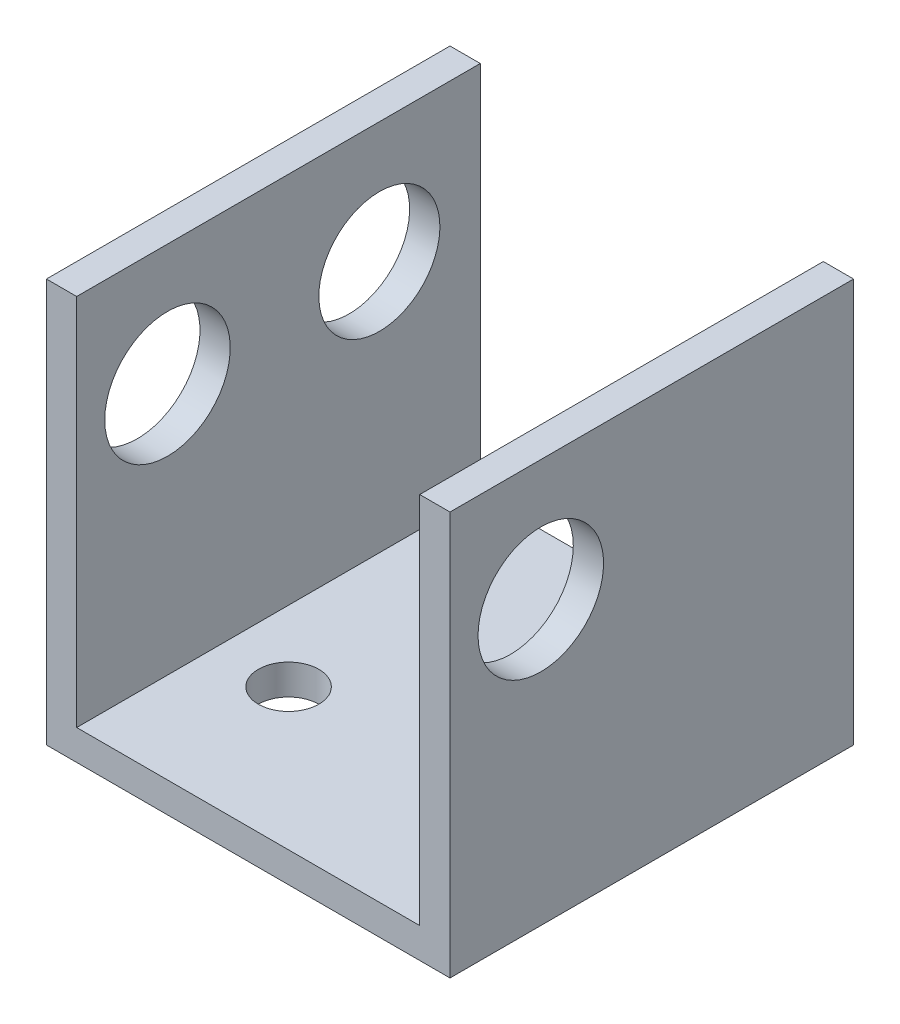
ISO-10303-21;
HEADER;
FILE_DESCRIPTION(('STEP AP214'),'2;1');
FILE_NAME('part.step','',(''),(''),'','','');
FILE_SCHEMA(('AUTOMOTIVE_DESIGN { 1 0 10303 214 1 1 1 1 }'));
ENDSEC;
DATA;
#1=APPLICATION_CONTEXT('core data for automotive mechanical design processes');
#2=APPLICATION_PROTOCOL_DEFINITION('international standard','automotive_design',2000,#1);
#3=PRODUCT_CONTEXT('',#1,'mechanical');
#4=PRODUCT('Part','Part','',(#3));
#5=PRODUCT_RELATED_PRODUCT_CATEGORY('part','',(#4));
#6=PRODUCT_DEFINITION_FORMATION('','',#4);
#7=PRODUCT_DEFINITION_CONTEXT('part definition',#1,'design');
#8=PRODUCT_DEFINITION('design','',#6,#7);
#9=PRODUCT_DEFINITION_SHAPE('','',#8);
#10=(LENGTH_UNIT() NAMED_UNIT(*) SI_UNIT(.MILLI.,.METRE.));
#11=(NAMED_UNIT(*) PLANE_ANGLE_UNIT() SI_UNIT($,.RADIAN.));
#12=(NAMED_UNIT(*) SI_UNIT($,.STERADIAN.) SOLID_ANGLE_UNIT());
#13=UNCERTAINTY_MEASURE_WITH_UNIT(LENGTH_MEASURE(1.E-05),#10,'distance_accuracy_value','');
#14=(GEOMETRIC_REPRESENTATION_CONTEXT(3) GLOBAL_UNCERTAINTY_ASSIGNED_CONTEXT((#13)) GLOBAL_UNIT_ASSIGNED_CONTEXT((#10,
#11,#12)) REPRESENTATION_CONTEXT('',''));
#15=CARTESIAN_POINT('',(0.,0.,0.));
#16=DIRECTION('',(0.,0.,1.));
#17=DIRECTION('',(1.,0.,0.));
#18=AXIS2_PLACEMENT_3D('',#15,#16,#17);
#19=CARTESIAN_POINT('',(-31.1485585296292,-16.6161569826708,20.));
#20=DIRECTION('',(1.,0.,0.));
#21=DIRECTION('',(0.,0.,-1.));
#22=AXIS2_PLACEMENT_3D('',#19,#20,#21);
#23=PLANE('',#22);
#24=CARTESIAN_POINT('',(-31.1485585296292,-2.61615698267076,15.5));
#25=DIRECTION('',(-1.,0.,0.));
#26=DIRECTION('',(0.,0.,1.));
#27=AXIS2_PLACEMENT_3D('',#24,#25,#26);
#28=CIRCLE('',#27,3.11);
#29=CARTESIAN_POINT('',(-31.1485585296292,-2.61615698267076,18.61));
#30=VERTEX_POINT('',#29);
#31=EDGE_CURVE('E196',#30,#30,#28,.T.);
#32=ORIENTED_EDGE('',*,*,#31,.F.);
#33=EDGE_LOOP('',(#32));
#34=FACE_BOUND('',#33,.T.);
#35=CARTESIAN_POINT('',(-31.1485585296292,-2.61615698267076,5.));
#36=DIRECTION('',(1.,0.,0.));
#37=DIRECTION('',(0.,1.,0.));
#38=AXIS2_PLACEMENT_3D('',#35,#36,#37);
#39=CIRCLE('',#38,3.);
#40=CARTESIAN_POINT('',(-31.1485585296292,0.383843017329243,5.));
#41=VERTEX_POINT('',#40);
#42=EDGE_CURVE('E185',#41,#41,#39,.T.);
#43=ORIENTED_EDGE('',*,*,#42,.T.);
#44=EDGE_LOOP('',(#43));
#45=FACE_BOUND('',#44,.T.);
#46=DIRECTION('',(0.,-1.,0.));
#47=VECTOR('',#46,1.);
#48=CARTESIAN_POINT('',(-31.1485585296292,-16.6161569826708,0.));
#49=LINE('',#48,#47);
#50=CARTESIAN_POINT('',(-31.1485585296292,3.38384301732924,0.));
#51=VERTEX_POINT('',#50);
#52=CARTESIAN_POINT('',(-31.1485585296292,-16.6161569826708,0.));
#53=VERTEX_POINT('',#52);
#54=EDGE_CURVE('E127',#51,#53,#49,.T.);
#55=ORIENTED_EDGE('',*,*,#54,.T.);
#56=DIRECTION('',(0.,0.,-1.));
#57=VECTOR('',#56,1.);
#58=CARTESIAN_POINT('',(-31.1485585296292,-16.6161569826708,20.));
#59=LINE('',#58,#57);
#60=CARTESIAN_POINT('',(-31.1485585296292,-16.6161569826708,20.));
#61=VERTEX_POINT('',#60);
#62=EDGE_CURVE('E11',#61,#53,#59,.T.);
#63=ORIENTED_EDGE('',*,*,#62,.F.);
#64=DIRECTION('',(0.,-1.,0.));
#65=VECTOR('',#64,1.);
#66=CARTESIAN_POINT('',(-31.1485585296292,-16.6161569826708,20.));
#67=LINE('',#66,#65);
#68=CARTESIAN_POINT('',(-31.1485585296292,3.38384301732924,20.));
#69=VERTEX_POINT('',#68);
#70=EDGE_CURVE('E142',#69,#61,#67,.T.);
#71=ORIENTED_EDGE('',*,*,#70,.F.);
#72=DIRECTION('',(0.,0.,-1.));
#73=VECTOR('',#72,1.);
#74=CARTESIAN_POINT('',(-31.1485585296292,3.38384301732924,20.));
#75=LINE('',#74,#73);
#76=EDGE_CURVE('E123',#69,#51,#75,.T.);
#77=ORIENTED_EDGE('',*,*,#76,.T.);
#78=EDGE_LOOP('',(#55,#63,#71,#77));
#79=FACE_BOUND('',#78,.T.);
#80=ADVANCED_FACE('F30',(#34,#45,#79),#23,.F.);
#81=CARTESIAN_POINT('',(-11.1485585296292,-16.6161569826708,20.));
#82=DIRECTION('',(0.,1.,0.));
#83=DIRECTION('',(-1.,0.,0.));
#84=AXIS2_PLACEMENT_3D('',#81,#82,#83);
#85=PLANE('',#84);
#86=CARTESIAN_POINT('',(-16.1485585296292,-16.6161569826708,7.));
#87=DIRECTION('',(0.,1.,0.));
#88=DIRECTION('',(-1.,0.,0.));
#89=AXIS2_PLACEMENT_3D('',#86,#87,#88);
#90=CIRCLE('',#89,1.5);
#91=CARTESIAN_POINT('',(-17.6485585296292,-16.6161569826708,7.));
#92=VERTEX_POINT('',#91);
#93=EDGE_CURVE('E179',#92,#92,#90,.T.);
#94=ORIENTED_EDGE('',*,*,#93,.T.);
#95=EDGE_LOOP('',(#94));
#96=FACE_BOUND('',#95,.T.);
#97=CARTESIAN_POINT('',(-26.1485585296292,-16.6161569826708,13.));
#98=DIRECTION('',(0.,1.,0.));
#99=DIRECTION('',(-1.,0.,0.));
#100=AXIS2_PLACEMENT_3D('',#97,#98,#99);
#101=CIRCLE('',#100,1.5);
#102=CARTESIAN_POINT('',(-27.6485585296292,-16.6161569826708,13.));
#103=VERTEX_POINT('',#102);
#104=EDGE_CURVE('E131',#103,#103,#101,.T.);
#105=ORIENTED_EDGE('',*,*,#104,.T.);
#106=EDGE_LOOP('',(#105));
#107=FACE_BOUND('',#106,.T.);
#108=DIRECTION('',(1.,0.,0.));
#109=VECTOR('',#108,1.);
#110=CARTESIAN_POINT('',(-11.1485585296292,-16.6161569826708,0.));
#111=LINE('',#110,#109);
#112=CARTESIAN_POINT('',(-11.1485585296292,-16.6161569826708,0.));
#113=VERTEX_POINT('',#112);
#114=EDGE_CURVE('E130',#53,#113,#111,.T.);
#115=ORIENTED_EDGE('',*,*,#114,.T.);
#116=DIRECTION('',(0.,0.,-1.));
#117=VECTOR('',#116,1.);
#118=CARTESIAN_POINT('',(-11.1485585296292,-16.6161569826708,20.));
#119=LINE('',#118,#117);
#120=CARTESIAN_POINT('',(-11.1485585296292,-16.6161569826708,20.));
#121=VERTEX_POINT('',#120);
#122=EDGE_CURVE('E39',#121,#113,#119,.T.);
#123=ORIENTED_EDGE('',*,*,#122,.F.);
#124=DIRECTION('',(1.,0.,0.));
#125=VECTOR('',#124,1.);
#126=CARTESIAN_POINT('',(-11.1485585296292,-16.6161569826708,20.));
#127=LINE('',#126,#125);
#128=EDGE_CURVE('E90',#61,#121,#127,.T.);
#129=ORIENTED_EDGE('',*,*,#128,.F.);
#130=ORIENTED_EDGE('',*,*,#62,.T.);
#131=EDGE_LOOP('',(#115,#123,#129,#130));
#132=FACE_BOUND('',#131,.T.);
#133=ADVANCED_FACE('F223',(#96,#107,#132),#85,.F.);
#134=CARTESIAN_POINT('',(-11.1485585296292,3.38384301732925,20.));
#135=DIRECTION('',(-1.,0.,0.));
#136=DIRECTION('',(0.,-1.,0.));
#137=AXIS2_PLACEMENT_3D('',#134,#135,#136);
#138=PLANE('',#137);
#139=CARTESIAN_POINT('',(-11.1485585296292,-2.61615698267076,15.5));
#140=DIRECTION('',(-1.,0.,0.));
#141=DIRECTION('',(0.,0.,1.));
#142=AXIS2_PLACEMENT_3D('',#139,#140,#141);
#143=CIRCLE('',#142,3.11);
#144=CARTESIAN_POINT('',(-11.1485585296292,-2.61615698267076,18.61));
#145=VERTEX_POINT('',#144);
#146=EDGE_CURVE('E199',#145,#145,#143,.T.);
#147=ORIENTED_EDGE('',*,*,#146,.T.);
#148=EDGE_LOOP('',(#147));
#149=FACE_BOUND('',#148,.T.);
#150=DIRECTION('',(0.,1.,0.));
#151=VECTOR('',#150,1.);
#152=CARTESIAN_POINT('',(-11.1485585296292,3.38384301732925,0.));
#153=LINE('',#152,#151);
#154=CARTESIAN_POINT('',(-11.1485585296292,3.38384301732925,0.));
#155=VERTEX_POINT('',#154);
#156=EDGE_CURVE('E133',#113,#155,#153,.T.);
#157=ORIENTED_EDGE('',*,*,#156,.T.);
#158=DIRECTION('',(0.,0.,-1.));
#159=VECTOR('',#158,1.);
#160=CARTESIAN_POINT('',(-11.1485585296292,3.38384301732925,20.));
#161=LINE('',#160,#159);
#162=CARTESIAN_POINT('',(-11.1485585296292,3.38384301732925,20.));
#163=VERTEX_POINT('',#162);
#164=EDGE_CURVE('E149',#163,#155,#161,.T.);
#165=ORIENTED_EDGE('',*,*,#164,.F.);
#166=DIRECTION('',(0.,1.,0.));
#167=VECTOR('',#166,1.);
#168=CARTESIAN_POINT('',(-11.1485585296292,3.38384301732925,20.));
#169=LINE('',#168,#167);
#170=EDGE_CURVE('E158',#121,#163,#169,.T.);
#171=ORIENTED_EDGE('',*,*,#170,.F.);
#172=ORIENTED_EDGE('',*,*,#122,.T.);
#173=EDGE_LOOP('',(#157,#165,#171,#172));
#174=FACE_BOUND('',#173,.T.);
#175=ADVANCED_FACE('F156',(#149,#174),#138,.F.);
#176=CARTESIAN_POINT('',(-12.6485585296292,3.38384301732925,20.));
#177=DIRECTION('',(0.,-1.,0.));
#178=DIRECTION('',(0.,0.,-1.));
#179=AXIS2_PLACEMENT_3D('',#176,#177,#178);
#180=PLANE('',#179);
#181=DIRECTION('',(-1.,0.,0.));
#182=VECTOR('',#181,1.);
#183=CARTESIAN_POINT('',(-12.6485585296292,3.38384301732925,0.));
#184=LINE('',#183,#182);
#185=CARTESIAN_POINT('',(-12.6485585296292,3.38384301732925,0.));
#186=VERTEX_POINT('',#185);
#187=EDGE_CURVE('E135',#155,#186,#184,.T.);
#188=ORIENTED_EDGE('',*,*,#187,.T.);
#189=DIRECTION('',(0.,0.,-1.));
#190=VECTOR('',#189,1.);
#191=CARTESIAN_POINT('',(-12.6485585296292,3.38384301732925,20.));
#192=LINE('',#191,#190);
#193=CARTESIAN_POINT('',(-12.6485585296292,3.38384301732925,20.));
#194=VERTEX_POINT('',#193);
#195=EDGE_CURVE('E146',#194,#186,#192,.T.);
#196=ORIENTED_EDGE('',*,*,#195,.F.);
#197=DIRECTION('',(-1.,0.,0.));
#198=VECTOR('',#197,1.);
#199=CARTESIAN_POINT('',(-12.6485585296292,3.38384301732925,20.));
#200=LINE('',#199,#198);
#201=EDGE_CURVE('E170',#163,#194,#200,.T.);
#202=ORIENTED_EDGE('',*,*,#201,.F.);
#203=ORIENTED_EDGE('',*,*,#164,.T.);
#204=EDGE_LOOP('',(#188,#196,#202,#203));
#205=FACE_BOUND('',#204,.T.);
#206=ADVANCED_FACE('F166',(#205),#180,.F.);
#207=CARTESIAN_POINT('',(-12.6485585296292,-15.1161569826708,20.));
#208=DIRECTION('',(1.,0.,0.));
#209=DIRECTION('',(0.,0.,-1.));
#210=AXIS2_PLACEMENT_3D('',#207,#208,#209);
#211=PLANE('',#210);
#212=CARTESIAN_POINT('',(-12.6485585296292,-2.61615698267076,15.5));
#213=DIRECTION('',(1.,0.,0.));
#214=DIRECTION('',(0.,0.,-1.));
#215=AXIS2_PLACEMENT_3D('',#212,#213,#214);
#216=CIRCLE('',#215,3.11);
#217=CARTESIAN_POINT('',(-12.6485585296292,-2.61615698267076,12.39));
#218=VERTEX_POINT('',#217);
#219=EDGE_CURVE('E191',#218,#218,#216,.T.);
#220=ORIENTED_EDGE('',*,*,#219,.T.);
#221=EDGE_LOOP('',(#220));
#222=FACE_BOUND('',#221,.T.);
#223=DIRECTION('',(0.,-1.,0.));
#224=VECTOR('',#223,1.);
#225=CARTESIAN_POINT('',(-12.6485585296292,-15.1161569826708,0.));
#226=LINE('',#225,#224);
#227=CARTESIAN_POINT('',(-12.6485585296292,-15.1161569826708,0.));
#228=VERTEX_POINT('',#227);
#229=EDGE_CURVE('E137',#186,#228,#226,.T.);
#230=ORIENTED_EDGE('',*,*,#229,.T.);
#231=DIRECTION('',(0.,0.,-1.));
#232=VECTOR('',#231,1.);
#233=CARTESIAN_POINT('',(-12.6485585296292,-15.1161569826708,20.));
#234=LINE('',#233,#232);
#235=CARTESIAN_POINT('',(-12.6485585296292,-15.1161569826708,20.));
#236=VERTEX_POINT('',#235);
#237=EDGE_CURVE('E118',#236,#228,#234,.T.);
#238=ORIENTED_EDGE('',*,*,#237,.F.);
#239=DIRECTION('',(0.,-1.,0.));
#240=VECTOR('',#239,1.);
#241=CARTESIAN_POINT('',(-12.6485585296292,-15.1161569826708,20.));
#242=LINE('',#241,#240);
#243=EDGE_CURVE('E109',#194,#236,#242,.T.);
#244=ORIENTED_EDGE('',*,*,#243,.F.);
#245=ORIENTED_EDGE('',*,*,#195,.T.);
#246=EDGE_LOOP('',(#230,#238,#244,#245));
#247=FACE_BOUND('',#246,.T.);
#248=ADVANCED_FACE('F169',(#222,#247),#211,.F.);
#249=CARTESIAN_POINT('',(-29.6485585296292,-15.1161569826708,20.));
#250=DIRECTION('',(0.,-1.,0.));
#251=DIRECTION('',(0.,0.,-1.));
#252=AXIS2_PLACEMENT_3D('',#249,#250,#251);
#253=PLANE('',#252);
#254=CARTESIAN_POINT('',(-16.1485585296292,-15.1161569826708,7.));
#255=DIRECTION('',(0.,1.,0.));
#256=DIRECTION('',(-1.,0.,0.));
#257=AXIS2_PLACEMENT_3D('',#254,#255,#256);
#258=CIRCLE('',#257,1.5);
#259=CARTESIAN_POINT('',(-17.6485585296292,-15.1161569826708,7.));
#260=VERTEX_POINT('',#259);
#261=EDGE_CURVE('E182',#260,#260,#258,.T.);
#262=ORIENTED_EDGE('',*,*,#261,.F.);
#263=EDGE_LOOP('',(#262));
#264=FACE_BOUND('',#263,.T.);
#265=CARTESIAN_POINT('',(-26.1485585296292,-15.1161569826708,13.));
#266=DIRECTION('',(0.,1.,0.));
#267=DIRECTION('',(-1.,0.,0.));
#268=AXIS2_PLACEMENT_3D('',#265,#266,#267);
#269=CIRCLE('',#268,1.5);
#270=CARTESIAN_POINT('',(-27.6485585296292,-15.1161569826708,13.));
#271=VERTEX_POINT('',#270);
#272=EDGE_CURVE('E176',#271,#271,#269,.T.);
#273=ORIENTED_EDGE('',*,*,#272,.F.);
#274=EDGE_LOOP('',(#273));
#275=FACE_BOUND('',#274,.T.);
#276=DIRECTION('',(-1.,0.,0.));
#277=VECTOR('',#276,1.);
#278=CARTESIAN_POINT('',(-29.6485585296292,-15.1161569826708,0.));
#279=LINE('',#278,#277);
#280=CARTESIAN_POINT('',(-29.6485585296292,-15.1161569826708,0.));
#281=VERTEX_POINT('',#280);
#282=EDGE_CURVE('E117',#228,#281,#279,.T.);
#283=ORIENTED_EDGE('',*,*,#282,.T.);
#284=DIRECTION('',(0.,0.,-1.));
#285=VECTOR('',#284,1.);
#286=CARTESIAN_POINT('',(-29.6485585296292,-15.1161569826708,20.));
#287=LINE('',#286,#285);
#288=CARTESIAN_POINT('',(-29.6485585296292,-15.1161569826708,20.));
#289=VERTEX_POINT('',#288);
#290=EDGE_CURVE('E114',#289,#281,#287,.T.);
#291=ORIENTED_EDGE('',*,*,#290,.F.);
#292=DIRECTION('',(-1.,0.,0.));
#293=VECTOR('',#292,1.);
#294=CARTESIAN_POINT('',(-29.6485585296292,-15.1161569826708,20.));
#295=LINE('',#294,#293);
#296=EDGE_CURVE('E103',#236,#289,#295,.T.);
#297=ORIENTED_EDGE('',*,*,#296,.F.);
#298=ORIENTED_EDGE('',*,*,#237,.T.);
#299=EDGE_LOOP('',(#283,#291,#297,#298));
#300=FACE_BOUND('',#299,.T.);
#301=ADVANCED_FACE('F115',(#264,#275,#300),#253,.F.);
#302=CARTESIAN_POINT('',(-29.6485585296292,3.38384301732924,20.));
#303=DIRECTION('',(-1.,0.,0.));
#304=DIRECTION('',(0.,-1.,0.));
#305=AXIS2_PLACEMENT_3D('',#302,#303,#304);
#306=PLANE('',#305);
#307=CARTESIAN_POINT('',(-29.6485585296292,-2.61615698267076,15.5));
#308=DIRECTION('',(-1.,0.,0.));
#309=DIRECTION('',(0.,-1.,0.));
#310=AXIS2_PLACEMENT_3D('',#307,#308,#309);
#311=CIRCLE('',#310,3.11);
#312=CARTESIAN_POINT('',(-29.6485585296292,-5.72615698267076,15.5));
#313=VERTEX_POINT('',#312);
#314=EDGE_CURVE('E33',#313,#313,#311,.T.);
#315=ORIENTED_EDGE('',*,*,#314,.T.);
#316=EDGE_LOOP('',(#315));
#317=FACE_BOUND('',#316,.T.);
#318=CARTESIAN_POINT('',(-29.6485585296292,-2.61615698267076,5.));
#319=DIRECTION('',(1.,0.,0.));
#320=DIRECTION('',(0.,1.,0.));
#321=AXIS2_PLACEMENT_3D('',#318,#319,#320);
#322=CIRCLE('',#321,3.);
#323=CARTESIAN_POINT('',(-29.6485585296292,0.383843017329243,5.));
#324=VERTEX_POINT('',#323);
#325=EDGE_CURVE('E188',#324,#324,#322,.T.);
#326=ORIENTED_EDGE('',*,*,#325,.F.);
#327=EDGE_LOOP('',(#326));
#328=FACE_BOUND('',#327,.T.);
#329=DIRECTION('',(0.,1.,0.));
#330=VECTOR('',#329,1.);
#331=CARTESIAN_POINT('',(-29.6485585296292,3.38384301732924,0.));
#332=LINE('',#331,#330);
#333=CARTESIAN_POINT('',(-29.6485585296292,3.38384301732924,0.));
#334=VERTEX_POINT('',#333);
#335=EDGE_CURVE('E76',#281,#334,#332,.T.);
#336=ORIENTED_EDGE('',*,*,#335,.T.);
#337=DIRECTION('',(0.,0.,-1.));
#338=VECTOR('',#337,1.);
#339=CARTESIAN_POINT('',(-29.6485585296292,3.38384301732924,20.));
#340=LINE('',#339,#338);
#341=CARTESIAN_POINT('',(-29.6485585296292,3.38384301732924,20.));
#342=VERTEX_POINT('',#341);
#343=EDGE_CURVE('E119',#342,#334,#340,.T.);
#344=ORIENTED_EDGE('',*,*,#343,.F.);
#345=DIRECTION('',(0.,1.,0.));
#346=VECTOR('',#345,1.);
#347=CARTESIAN_POINT('',(-29.6485585296292,3.38384301732924,20.));
#348=LINE('',#347,#346);
#349=EDGE_CURVE('E107',#289,#342,#348,.T.);
#350=ORIENTED_EDGE('',*,*,#349,.F.);
#351=ORIENTED_EDGE('',*,*,#290,.T.);
#352=EDGE_LOOP('',(#336,#344,#350,#351));
#353=FACE_BOUND('',#352,.T.);
#354=ADVANCED_FACE('F121',(#317,#328,#353),#306,.F.);
#355=CARTESIAN_POINT('',(-31.1485585296292,3.38384301732924,20.));
#356=DIRECTION('',(0.,-1.,0.));
#357=DIRECTION('',(0.,0.,-1.));
#358=AXIS2_PLACEMENT_3D('',#355,#356,#357);
#359=PLANE('',#358);
#360=DIRECTION('',(-1.,0.,0.));
#361=VECTOR('',#360,1.);
#362=CARTESIAN_POINT('',(-31.1485585296292,3.38384301732924,0.));
#363=LINE('',#362,#361);
#364=EDGE_CURVE('E82',#334,#51,#363,.T.);
#365=ORIENTED_EDGE('',*,*,#364,.T.);
#366=ORIENTED_EDGE('',*,*,#76,.F.);
#367=DIRECTION('',(-1.,0.,0.));
#368=VECTOR('',#367,1.);
#369=CARTESIAN_POINT('',(-31.1485585296292,3.38384301732924,20.));
#370=LINE('',#369,#368);
#371=EDGE_CURVE('E47',#342,#69,#370,.T.);
#372=ORIENTED_EDGE('',*,*,#371,.F.);
#373=ORIENTED_EDGE('',*,*,#343,.T.);
#374=EDGE_LOOP('',(#365,#366,#372,#373));
#375=FACE_BOUND('',#374,.T.);
#376=ADVANCED_FACE('F235',(#375),#359,.F.);
#377=CARTESIAN_POINT('',(-31.1485585296292,3.38384301732924,20.));
#378=DIRECTION('',(0.,0.,-1.));
#379=DIRECTION('',(-1.,0.,0.));
#380=AXIS2_PLACEMENT_3D('',#377,#378,#379);
#381=PLANE('',#380);
#382=ORIENTED_EDGE('',*,*,#70,.T.);
#383=ORIENTED_EDGE('',*,*,#128,.T.);
#384=ORIENTED_EDGE('',*,*,#170,.T.);
#385=ORIENTED_EDGE('',*,*,#201,.T.);
#386=ORIENTED_EDGE('',*,*,#243,.T.);
#387=ORIENTED_EDGE('',*,*,#296,.T.);
#388=ORIENTED_EDGE('',*,*,#349,.T.);
#389=ORIENTED_EDGE('',*,*,#371,.T.);
#390=EDGE_LOOP('',(#382,#383,#384,#385,#386,#387,#388,#389));
#391=FACE_BOUND('',#390,.T.);
#392=ADVANCED_FACE('F105',(#391),#381,.F.);
#393=CARTESIAN_POINT('',(-31.1485585296292,3.38384301732924,0.));
#394=DIRECTION('',(0.,0.,-1.));
#395=DIRECTION('',(-1.,0.,0.));
#396=AXIS2_PLACEMENT_3D('',#393,#394,#395);
#397=PLANE('',#396);
#398=ORIENTED_EDGE('',*,*,#54,.F.);
#399=ORIENTED_EDGE('',*,*,#364,.F.);
#400=ORIENTED_EDGE('',*,*,#335,.F.);
#401=ORIENTED_EDGE('',*,*,#282,.F.);
#402=ORIENTED_EDGE('',*,*,#229,.F.);
#403=ORIENTED_EDGE('',*,*,#187,.F.);
#404=ORIENTED_EDGE('',*,*,#156,.F.);
#405=ORIENTED_EDGE('',*,*,#114,.F.);
#406=EDGE_LOOP('',(#398,#399,#400,#401,#402,#403,#404,#405));
#407=FACE_BOUND('',#406,.T.);
#408=ADVANCED_FACE('F162',(#407),#397,.T.);
#409=CARTESIAN_POINT('',(-26.1485585296292,-16.6161569826708,13.));
#410=DIRECTION('',(0.,1.,0.));
#411=DIRECTION('',(-1.,0.,0.));
#412=AXIS2_PLACEMENT_3D('',#409,#410,#411);
#413=CYLINDRICAL_SURFACE('',#412,1.5);
#414=ORIENTED_EDGE('',*,*,#104,.F.);
#415=EDGE_LOOP('',(#414));
#416=FACE_BOUND('',#415,.T.);
#417=ORIENTED_EDGE('',*,*,#272,.T.);
#418=EDGE_LOOP('',(#417));
#419=FACE_BOUND('',#418,.T.);
#420=ADVANCED_FACE('F302',(#416,#419),#413,.F.);
#421=CARTESIAN_POINT('',(-16.1485585296292,-16.6161569826708,7.));
#422=DIRECTION('',(0.,1.,0.));
#423=DIRECTION('',(-1.,0.,0.));
#424=AXIS2_PLACEMENT_3D('',#421,#422,#423);
#425=CYLINDRICAL_SURFACE('',#424,1.5);
#426=ORIENTED_EDGE('',*,*,#93,.F.);
#427=EDGE_LOOP('',(#426));
#428=FACE_BOUND('',#427,.T.);
#429=ORIENTED_EDGE('',*,*,#261,.T.);
#430=EDGE_LOOP('',(#429));
#431=FACE_BOUND('',#430,.T.);
#432=ADVANCED_FACE('F219',(#428,#431),#425,.F.);
#433=CARTESIAN_POINT('',(-31.1485585296292,-2.61615698267076,5.));
#434=DIRECTION('',(1.,0.,0.));
#435=DIRECTION('',(0.,1.,0.));
#436=AXIS2_PLACEMENT_3D('',#433,#434,#435);
#437=CYLINDRICAL_SURFACE('',#436,3.);
#438=ORIENTED_EDGE('',*,*,#42,.F.);
#439=EDGE_LOOP('',(#438));
#440=FACE_BOUND('',#439,.T.);
#441=ORIENTED_EDGE('',*,*,#325,.T.);
#442=EDGE_LOOP('',(#441));
#443=FACE_BOUND('',#442,.T.);
#444=ADVANCED_FACE('F211',(#440,#443),#437,.F.);
#445=CARTESIAN_POINT('',(-11.1485585296292,-2.61615698267076,15.5));
#446=DIRECTION('',(-1.,0.,0.));
#447=DIRECTION('',(0.,0.,1.));
#448=AXIS2_PLACEMENT_3D('',#445,#446,#447);
#449=CYLINDRICAL_SURFACE('',#448,3.11);
#450=ORIENTED_EDGE('',*,*,#31,.T.);
#451=EDGE_LOOP('',(#450));
#452=FACE_BOUND('',#451,.T.);
#453=ORIENTED_EDGE('',*,*,#314,.F.);
#454=EDGE_LOOP('',(#453));
#455=FACE_BOUND('',#454,.T.);
#456=ADVANCED_FACE('F208',(#452,#455),#449,.F.);
#457=ORIENTED_EDGE('',*,*,#146,.F.);
#458=EDGE_LOOP('',(#457));
#459=FACE_BOUND('',#458,.T.);
#460=ORIENTED_EDGE('',*,*,#219,.F.);
#461=EDGE_LOOP('',(#460));
#462=FACE_BOUND('',#461,.T.);
#463=ADVANCED_FACE('F210',(#459,#462),#449,.F.);
#464=CLOSED_SHELL('',(#80,#133,#175,#206,#248,#301,#354,#376,#392,#408,#420,#432,#444,#456,#463));
#465=MANIFOLD_SOLID_BREP('B2',#464);
#466=ADVANCED_BREP_SHAPE_REPRESENTATION('',(#18,#465),#14);
#467=SHAPE_DEFINITION_REPRESENTATION(#9,#466);
ENDSEC;
END-ISO-10303-21;
